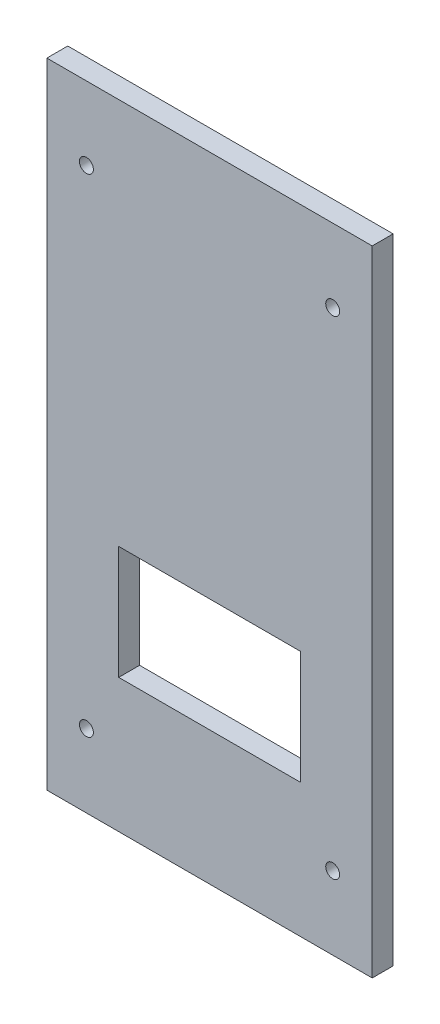
ISO-10303-21;
HEADER;
FILE_DESCRIPTION(('STEP AP214'),'2;1');
FILE_NAME('part.step','',(''),(''),'','','');
FILE_SCHEMA(('AUTOMOTIVE_DESIGN { 1 0 10303 214 1 1 1 1 }'));
ENDSEC;
DATA;
#1=APPLICATION_CONTEXT('core data for automotive mechanical design processes');
#2=APPLICATION_PROTOCOL_DEFINITION('international standard','automotive_design',2000,#1);
#3=PRODUCT_CONTEXT('',#1,'mechanical');
#4=PRODUCT('Part','Part','',(#3));
#5=PRODUCT_RELATED_PRODUCT_CATEGORY('part','',(#4));
#6=PRODUCT_DEFINITION_FORMATION('','',#4);
#7=PRODUCT_DEFINITION_CONTEXT('part definition',#1,'design');
#8=PRODUCT_DEFINITION('design','',#6,#7);
#9=PRODUCT_DEFINITION_SHAPE('','',#8);
#10=(LENGTH_UNIT() NAMED_UNIT(*) SI_UNIT(.MILLI.,.METRE.));
#11=(NAMED_UNIT(*) PLANE_ANGLE_UNIT() SI_UNIT($,.RADIAN.));
#12=(NAMED_UNIT(*) SI_UNIT($,.STERADIAN.) SOLID_ANGLE_UNIT());
#13=UNCERTAINTY_MEASURE_WITH_UNIT(LENGTH_MEASURE(1.E-05),#10,'distance_accuracy_value','');
#14=(GEOMETRIC_REPRESENTATION_CONTEXT(3) GLOBAL_UNCERTAINTY_ASSIGNED_CONTEXT((#13)) GLOBAL_UNIT_ASSIGNED_CONTEXT((#10,
#11,#12)) REPRESENTATION_CONTEXT('',''));
#15=CARTESIAN_POINT('',(0.,0.,0.));
#16=DIRECTION('',(0.,0.,1.));
#17=DIRECTION('',(1.,0.,0.));
#18=AXIS2_PLACEMENT_3D('',#15,#16,#17);
#19=CARTESIAN_POINT('',(0.,0.,3.));
#20=DIRECTION('',(0.,0.,1.));
#21=DIRECTION('',(1.,0.,0.));
#22=AXIS2_PLACEMENT_3D('',#19,#20,#21);
#23=PLANE('',#22);
#24=DIRECTION('',(-1.,0.,0.));
#25=VECTOR('',#24,1.);
#26=CARTESIAN_POINT('',(-13.0367519837217,-10.0460923834394,3.));
#27=LINE('',#26,#25);
#28=CARTESIAN_POINT('',(13.0367519837217,-10.0460923834394,3.));
#29=VERTEX_POINT('',#28);
#30=CARTESIAN_POINT('',(-13.0367519837217,-10.0460923834394,3.));
#31=VERTEX_POINT('',#30);
#32=EDGE_CURVE('E106',#29,#31,#27,.T.);
#33=ORIENTED_EDGE('',*,*,#32,.F.);
#34=DIRECTION('',(0.,1.,0.));
#35=VECTOR('',#34,1.);
#36=CARTESIAN_POINT('',(13.0367519837217,-10.0460923834394,3.));
#37=LINE('',#36,#35);
#38=CARTESIAN_POINT('',(13.0367519837217,-26.3240790269605,3.));
#39=VERTEX_POINT('',#38);
#40=EDGE_CURVE('E98',#39,#29,#37,.T.);
#41=ORIENTED_EDGE('',*,*,#40,.F.);
#42=DIRECTION('',(1.,0.,0.));
#43=VECTOR('',#42,1.);
#44=CARTESIAN_POINT('',(-13.0367519837217,-26.3240790269605,3.));
#45=LINE('',#44,#43);
#46=CARTESIAN_POINT('',(-13.0367519837217,-26.3240790269605,3.));
#47=VERTEX_POINT('',#46);
#48=EDGE_CURVE('E121',#47,#39,#45,.T.);
#49=ORIENTED_EDGE('',*,*,#48,.F.);
#50=DIRECTION('',(0.,-1.,0.));
#51=VECTOR('',#50,1.);
#52=CARTESIAN_POINT('',(-13.0367519837217,-10.0460923834394,3.));
#53=LINE('',#52,#51);
#54=EDGE_CURVE('E119',#31,#47,#53,.T.);
#55=ORIENTED_EDGE('',*,*,#54,.F.);
#56=EDGE_LOOP('',(#33,#41,#49,#55));
#57=FACE_BOUND('',#56,.T.);
#58=CARTESIAN_POINT('',(-17.675,35.,3.));
#59=DIRECTION('',(0.,0.,1.));
#60=DIRECTION('',(-1.,0.,0.));
#61=AXIS2_PLACEMENT_3D('',#58,#59,#60);
#62=CIRCLE('',#61,1.);
#63=CARTESIAN_POINT('',(-18.675,35.,3.));
#64=VERTEX_POINT('',#63);
#65=EDGE_CURVE('E137',#64,#64,#62,.T.);
#66=ORIENTED_EDGE('',*,*,#65,.F.);
#67=EDGE_LOOP('',(#66));
#68=FACE_BOUND('',#67,.T.);
#69=CARTESIAN_POINT('',(17.675,35.,3.));
#70=DIRECTION('',(0.,0.,1.));
#71=DIRECTION('',(1.,0.,0.));
#72=AXIS2_PLACEMENT_3D('',#69,#70,#71);
#73=CIRCLE('',#72,1.);
#74=CARTESIAN_POINT('',(18.675,35.,3.));
#75=VERTEX_POINT('',#74);
#76=EDGE_CURVE('E149',#75,#75,#73,.T.);
#77=ORIENTED_EDGE('',*,*,#76,.F.);
#78=EDGE_LOOP('',(#77));
#79=FACE_BOUND('',#78,.T.);
#80=DIRECTION('',(0.,1.,0.));
#81=VECTOR('',#80,1.);
#82=CARTESIAN_POINT('',(23.35,45.5,3.));
#83=LINE('',#82,#81);
#84=CARTESIAN_POINT('',(23.35,-45.5,3.));
#85=VERTEX_POINT('',#84);
#86=CARTESIAN_POINT('',(23.35,45.5,3.));
#87=VERTEX_POINT('',#86);
#88=EDGE_CURVE('E155',#85,#87,#83,.T.);
#89=ORIENTED_EDGE('',*,*,#88,.T.);
#90=DIRECTION('',(-1.,0.,0.));
#91=VECTOR('',#90,1.);
#92=CARTESIAN_POINT('',(-23.35,45.5,3.));
#93=LINE('',#92,#91);
#94=CARTESIAN_POINT('',(-23.35,45.5,3.));
#95=VERTEX_POINT('',#94);
#96=EDGE_CURVE('E158',#87,#95,#93,.T.);
#97=ORIENTED_EDGE('',*,*,#96,.T.);
#98=DIRECTION('',(0.,-1.,0.));
#99=VECTOR('',#98,1.);
#100=CARTESIAN_POINT('',(-23.35,45.5,3.));
#101=LINE('',#100,#99);
#102=CARTESIAN_POINT('',(-23.35,-45.5,3.));
#103=VERTEX_POINT('',#102);
#104=EDGE_CURVE('E161',#95,#103,#101,.T.);
#105=ORIENTED_EDGE('',*,*,#104,.T.);
#106=DIRECTION('',(1.,0.,0.));
#107=VECTOR('',#106,1.);
#108=CARTESIAN_POINT('',(-23.35,-45.5,3.));
#109=LINE('',#108,#107);
#110=EDGE_CURVE('E163',#103,#85,#109,.T.);
#111=ORIENTED_EDGE('',*,*,#110,.T.);
#112=EDGE_LOOP('',(#89,#97,#105,#111));
#113=FACE_BOUND('',#112,.T.);
#114=CARTESIAN_POINT('',(-17.675,-35.,3.));
#115=DIRECTION('',(0.,0.,1.));
#116=DIRECTION('',(1.,0.,0.));
#117=AXIS2_PLACEMENT_3D('',#114,#115,#116);
#118=CIRCLE('',#117,1.);
#119=CARTESIAN_POINT('',(-16.675,-35.,3.));
#120=VERTEX_POINT('',#119);
#121=EDGE_CURVE('E143',#120,#120,#118,.T.);
#122=ORIENTED_EDGE('',*,*,#121,.F.);
#123=EDGE_LOOP('',(#122));
#124=FACE_BOUND('',#123,.T.);
#125=CARTESIAN_POINT('',(17.675,-35.,3.));
#126=DIRECTION('',(0.,0.,1.));
#127=DIRECTION('',(-1.,0.,0.));
#128=AXIS2_PLACEMENT_3D('',#125,#126,#127);
#129=CIRCLE('',#128,1.);
#130=CARTESIAN_POINT('',(16.675,-35.,3.));
#131=VERTEX_POINT('',#130);
#132=EDGE_CURVE('E127',#131,#131,#129,.T.);
#133=ORIENTED_EDGE('',*,*,#132,.F.);
#134=EDGE_LOOP('',(#133));
#135=FACE_BOUND('',#134,.T.);
#136=ADVANCED_FACE('F33',(#57,#68,#79,#113,#124,#135),#23,.T.);
#137=CARTESIAN_POINT('',(0.,0.,0.));
#138=DIRECTION('',(0.,0.,1.));
#139=DIRECTION('',(1.,0.,0.));
#140=AXIS2_PLACEMENT_3D('',#137,#138,#139);
#141=PLANE('',#140);
#142=CARTESIAN_POINT('',(-17.675,35.,0.));
#143=DIRECTION('',(0.,0.,1.));
#144=DIRECTION('',(-1.,0.,0.));
#145=AXIS2_PLACEMENT_3D('',#142,#143,#144);
#146=CIRCLE('',#145,1.);
#147=CARTESIAN_POINT('',(-18.675,35.,0.));
#148=VERTEX_POINT('',#147);
#149=EDGE_CURVE('E114',#148,#148,#146,.T.);
#150=ORIENTED_EDGE('',*,*,#149,.T.);
#151=EDGE_LOOP('',(#150));
#152=FACE_BOUND('',#151,.T.);
#153=CARTESIAN_POINT('',(-17.675,-35.,0.));
#154=DIRECTION('',(0.,0.,1.));
#155=DIRECTION('',(1.,0.,0.));
#156=AXIS2_PLACEMENT_3D('',#153,#154,#155);
#157=CIRCLE('',#156,1.);
#158=CARTESIAN_POINT('',(-16.675,-35.,0.));
#159=VERTEX_POINT('',#158);
#160=EDGE_CURVE('E140',#159,#159,#157,.T.);
#161=ORIENTED_EDGE('',*,*,#160,.T.);
#162=EDGE_LOOP('',(#161));
#163=FACE_BOUND('',#162,.T.);
#164=CARTESIAN_POINT('',(17.675,35.,0.));
#165=DIRECTION('',(0.,0.,1.));
#166=DIRECTION('',(1.,0.,0.));
#167=AXIS2_PLACEMENT_3D('',#164,#165,#166);
#168=CIRCLE('',#167,1.);
#169=CARTESIAN_POINT('',(18.675,35.,0.));
#170=VERTEX_POINT('',#169);
#171=EDGE_CURVE('E146',#170,#170,#168,.T.);
#172=ORIENTED_EDGE('',*,*,#171,.T.);
#173=EDGE_LOOP('',(#172));
#174=FACE_BOUND('',#173,.T.);
#175=DIRECTION('',(0.,1.,0.));
#176=VECTOR('',#175,1.);
#177=CARTESIAN_POINT('',(23.35,45.5,0.));
#178=LINE('',#177,#176);
#179=CARTESIAN_POINT('',(23.35,-45.5,0.));
#180=VERTEX_POINT('',#179);
#181=CARTESIAN_POINT('',(23.35,45.5,0.));
#182=VERTEX_POINT('',#181);
#183=EDGE_CURVE('E152',#180,#182,#178,.T.);
#184=ORIENTED_EDGE('',*,*,#183,.F.);
#185=DIRECTION('',(1.,0.,0.));
#186=VECTOR('',#185,1.);
#187=CARTESIAN_POINT('',(-23.35,-45.5,0.));
#188=LINE('',#187,#186);
#189=CARTESIAN_POINT('',(-23.35,-45.5,0.));
#190=VERTEX_POINT('',#189);
#191=EDGE_CURVE('E159',#190,#180,#188,.T.);
#192=ORIENTED_EDGE('',*,*,#191,.F.);
#193=DIRECTION('',(0.,-1.,0.));
#194=VECTOR('',#193,1.);
#195=CARTESIAN_POINT('',(-23.35,45.5,0.));
#196=LINE('',#195,#194);
#197=CARTESIAN_POINT('',(-23.35,45.5,0.));
#198=VERTEX_POINT('',#197);
#199=EDGE_CURVE('E170',#198,#190,#196,.T.);
#200=ORIENTED_EDGE('',*,*,#199,.F.);
#201=DIRECTION('',(-1.,0.,0.));
#202=VECTOR('',#201,1.);
#203=CARTESIAN_POINT('',(-23.35,45.5,0.));
#204=LINE('',#203,#202);
#205=EDGE_CURVE('E168',#182,#198,#204,.T.);
#206=ORIENTED_EDGE('',*,*,#205,.F.);
#207=EDGE_LOOP('',(#184,#192,#200,#206));
#208=FACE_BOUND('',#207,.T.);
#209=DIRECTION('',(0.,1.,0.));
#210=VECTOR('',#209,1.);
#211=CARTESIAN_POINT('',(13.0367519837217,-10.0460923834394,0.));
#212=LINE('',#211,#210);
#213=CARTESIAN_POINT('',(13.0367519837217,-26.3240790269605,0.));
#214=VERTEX_POINT('',#213);
#215=CARTESIAN_POINT('',(13.0367519837217,-10.0460923834394,0.));
#216=VERTEX_POINT('',#215);
#217=EDGE_CURVE('E56',#214,#216,#212,.T.);
#218=ORIENTED_EDGE('',*,*,#217,.T.);
#219=DIRECTION('',(-1.,0.,0.));
#220=VECTOR('',#219,1.);
#221=CARTESIAN_POINT('',(-13.0367519837217,-10.0460923834394,0.));
#222=LINE('',#221,#220);
#223=CARTESIAN_POINT('',(-13.0367519837217,-10.0460923834394,0.));
#224=VERTEX_POINT('',#223);
#225=EDGE_CURVE('E113',#216,#224,#222,.T.);
#226=ORIENTED_EDGE('',*,*,#225,.T.);
#227=DIRECTION('',(0.,-1.,0.));
#228=VECTOR('',#227,1.);
#229=CARTESIAN_POINT('',(-13.0367519837217,-10.0460923834394,0.));
#230=LINE('',#229,#228);
#231=CARTESIAN_POINT('',(-13.0367519837217,-26.3240790269605,0.));
#232=VERTEX_POINT('',#231);
#233=EDGE_CURVE('E129',#224,#232,#230,.T.);
#234=ORIENTED_EDGE('',*,*,#233,.T.);
#235=DIRECTION('',(1.,0.,0.));
#236=VECTOR('',#235,1.);
#237=CARTESIAN_POINT('',(-13.0367519837217,-26.3240790269605,0.));
#238=LINE('',#237,#236);
#239=EDGE_CURVE('E107',#232,#214,#238,.T.);
#240=ORIENTED_EDGE('',*,*,#239,.T.);
#241=EDGE_LOOP('',(#218,#226,#234,#240));
#242=FACE_BOUND('',#241,.T.);
#243=CARTESIAN_POINT('',(17.675,-35.,0.));
#244=DIRECTION('',(0.,0.,1.));
#245=DIRECTION('',(-1.,0.,0.));
#246=AXIS2_PLACEMENT_3D('',#243,#244,#245);
#247=CIRCLE('',#246,1.);
#248=CARTESIAN_POINT('',(16.675,-35.,0.));
#249=VERTEX_POINT('',#248);
#250=EDGE_CURVE('E261',#249,#249,#247,.T.);
#251=ORIENTED_EDGE('',*,*,#250,.T.);
#252=EDGE_LOOP('',(#251));
#253=FACE_BOUND('',#252,.T.);
#254=ADVANCED_FACE('F188',(#152,#163,#174,#208,#242,#253),#141,.F.);
#255=CARTESIAN_POINT('',(23.35,45.5,3.));
#256=DIRECTION('',(-1.,0.,0.));
#257=DIRECTION('',(0.,0.,1.));
#258=AXIS2_PLACEMENT_3D('',#255,#256,#257);
#259=PLANE('',#258);
#260=ORIENTED_EDGE('',*,*,#183,.T.);
#261=DIRECTION('',(0.,0.,-1.));
#262=VECTOR('',#261,1.);
#263=CARTESIAN_POINT('',(23.35,45.5,3.));
#264=LINE('',#263,#262);
#265=EDGE_CURVE('E11',#87,#182,#264,.T.);
#266=ORIENTED_EDGE('',*,*,#265,.F.);
#267=ORIENTED_EDGE('',*,*,#88,.F.);
#268=DIRECTION('',(0.,0.,-1.));
#269=VECTOR('',#268,1.);
#270=CARTESIAN_POINT('',(23.35,-45.5,3.));
#271=LINE('',#270,#269);
#272=EDGE_CURVE('E165',#85,#180,#271,.T.);
#273=ORIENTED_EDGE('',*,*,#272,.T.);
#274=EDGE_LOOP('',(#260,#266,#267,#273));
#275=FACE_BOUND('',#274,.T.);
#276=ADVANCED_FACE('F35',(#275),#259,.F.);
#277=CARTESIAN_POINT('',(-23.35,45.5,3.));
#278=DIRECTION('',(0.,-1.,0.));
#279=DIRECTION('',(0.,0.,-1.));
#280=AXIS2_PLACEMENT_3D('',#277,#278,#279);
#281=PLANE('',#280);
#282=ORIENTED_EDGE('',*,*,#205,.T.);
#283=DIRECTION('',(0.,0.,-1.));
#284=VECTOR('',#283,1.);
#285=CARTESIAN_POINT('',(-23.35,45.5,3.));
#286=LINE('',#285,#284);
#287=EDGE_CURVE('E41',#95,#198,#286,.T.);
#288=ORIENTED_EDGE('',*,*,#287,.F.);
#289=ORIENTED_EDGE('',*,*,#96,.F.);
#290=ORIENTED_EDGE('',*,*,#265,.T.);
#291=EDGE_LOOP('',(#282,#288,#289,#290));
#292=FACE_BOUND('',#291,.T.);
#293=ADVANCED_FACE('F199',(#292),#281,.F.);
#294=CARTESIAN_POINT('',(-23.35,45.5,3.));
#295=DIRECTION('',(1.,0.,0.));
#296=DIRECTION('',(0.,0.,-1.));
#297=AXIS2_PLACEMENT_3D('',#294,#295,#296);
#298=PLANE('',#297);
#299=ORIENTED_EDGE('',*,*,#199,.T.);
#300=DIRECTION('',(0.,0.,-1.));
#301=VECTOR('',#300,1.);
#302=CARTESIAN_POINT('',(-23.35,-45.5,3.));
#303=LINE('',#302,#301);
#304=EDGE_CURVE('E175',#103,#190,#303,.T.);
#305=ORIENTED_EDGE('',*,*,#304,.F.);
#306=ORIENTED_EDGE('',*,*,#104,.F.);
#307=ORIENTED_EDGE('',*,*,#287,.T.);
#308=EDGE_LOOP('',(#299,#305,#306,#307));
#309=FACE_BOUND('',#308,.T.);
#310=ADVANCED_FACE('F182',(#309),#298,.F.);
#311=CARTESIAN_POINT('',(-23.35,-45.5,3.));
#312=DIRECTION('',(0.,1.,0.));
#313=DIRECTION('',(0.,0.,1.));
#314=AXIS2_PLACEMENT_3D('',#311,#312,#313);
#315=PLANE('',#314);
#316=ORIENTED_EDGE('',*,*,#191,.T.);
#317=ORIENTED_EDGE('',*,*,#272,.F.);
#318=ORIENTED_EDGE('',*,*,#110,.F.);
#319=ORIENTED_EDGE('',*,*,#304,.T.);
#320=EDGE_LOOP('',(#316,#317,#318,#319));
#321=FACE_BOUND('',#320,.T.);
#322=ADVANCED_FACE('F192',(#321),#315,.F.);
#323=CARTESIAN_POINT('',(17.675,35.,3.));
#324=DIRECTION('',(0.,0.,-1.));
#325=DIRECTION('',(-1.,0.,0.));
#326=AXIS2_PLACEMENT_3D('',#323,#324,#325);
#327=CYLINDRICAL_SURFACE('',#326,1.);
#328=ORIENTED_EDGE('',*,*,#76,.T.);
#329=EDGE_LOOP('',(#328));
#330=FACE_BOUND('',#329,.T.);
#331=ORIENTED_EDGE('',*,*,#171,.F.);
#332=EDGE_LOOP('',(#331));
#333=FACE_BOUND('',#332,.T.);
#334=ADVANCED_FACE('F214',(#330,#333),#327,.F.);
#335=CARTESIAN_POINT('',(-17.675,-35.,3.));
#336=DIRECTION('',(0.,0.,-1.));
#337=DIRECTION('',(-1.,0.,0.));
#338=AXIS2_PLACEMENT_3D('',#335,#336,#337);
#339=CYLINDRICAL_SURFACE('',#338,1.);
#340=ORIENTED_EDGE('',*,*,#121,.T.);
#341=EDGE_LOOP('',(#340));
#342=FACE_BOUND('',#341,.T.);
#343=ORIENTED_EDGE('',*,*,#160,.F.);
#344=EDGE_LOOP('',(#343));
#345=FACE_BOUND('',#344,.T.);
#346=ADVANCED_FACE('F221',(#342,#345),#339,.F.);
#347=CARTESIAN_POINT('',(-17.675,35.,3.));
#348=DIRECTION('',(0.,0.,-1.));
#349=DIRECTION('',(-1.,0.,0.));
#350=AXIS2_PLACEMENT_3D('',#347,#348,#349);
#351=CYLINDRICAL_SURFACE('',#350,1.);
#352=ORIENTED_EDGE('',*,*,#65,.T.);
#353=EDGE_LOOP('',(#352));
#354=FACE_BOUND('',#353,.T.);
#355=ORIENTED_EDGE('',*,*,#149,.F.);
#356=EDGE_LOOP('',(#355));
#357=FACE_BOUND('',#356,.T.);
#358=ADVANCED_FACE('F226',(#354,#357),#351,.F.);
#359=CARTESIAN_POINT('',(13.0367519837217,-10.0460923834394,3.));
#360=DIRECTION('',(-1.,0.,0.));
#361=DIRECTION('',(0.,0.,1.));
#362=AXIS2_PLACEMENT_3D('',#359,#360,#361);
#363=PLANE('',#362);
#364=ORIENTED_EDGE('',*,*,#217,.F.);
#365=DIRECTION('',(0.,0.,-1.));
#366=VECTOR('',#365,1.);
#367=CARTESIAN_POINT('',(13.0367519837217,-26.3240790269605,3.));
#368=LINE('',#367,#366);
#369=EDGE_CURVE('E102',#39,#214,#368,.T.);
#370=ORIENTED_EDGE('',*,*,#369,.F.);
#371=ORIENTED_EDGE('',*,*,#40,.T.);
#372=DIRECTION('',(0.,0.,-1.));
#373=VECTOR('',#372,1.);
#374=CARTESIAN_POINT('',(13.0367519837217,-10.0460923834394,3.));
#375=LINE('',#374,#373);
#376=EDGE_CURVE('E101',#29,#216,#375,.T.);
#377=ORIENTED_EDGE('',*,*,#376,.T.);
#378=EDGE_LOOP('',(#364,#370,#371,#377));
#379=FACE_BOUND('',#378,.T.);
#380=ADVANCED_FACE('F100',(#379),#363,.T.);
#381=CARTESIAN_POINT('',(-13.0367519837217,-10.0460923834394,3.));
#382=DIRECTION('',(0.,-1.,0.));
#383=DIRECTION('',(0.,0.,-1.));
#384=AXIS2_PLACEMENT_3D('',#381,#382,#383);
#385=PLANE('',#384);
#386=ORIENTED_EDGE('',*,*,#225,.F.);
#387=ORIENTED_EDGE('',*,*,#376,.F.);
#388=ORIENTED_EDGE('',*,*,#32,.T.);
#389=DIRECTION('',(0.,0.,-1.));
#390=VECTOR('',#389,1.);
#391=CARTESIAN_POINT('',(-13.0367519837217,-10.0460923834394,3.));
#392=LINE('',#391,#390);
#393=EDGE_CURVE('E115',#31,#224,#392,.T.);
#394=ORIENTED_EDGE('',*,*,#393,.T.);
#395=EDGE_LOOP('',(#386,#387,#388,#394));
#396=FACE_BOUND('',#395,.T.);
#397=ADVANCED_FACE('F110',(#396),#385,.T.);
#398=CARTESIAN_POINT('',(-13.0367519837217,-10.0460923834394,3.));
#399=DIRECTION('',(1.,0.,0.));
#400=DIRECTION('',(0.,0.,-1.));
#401=AXIS2_PLACEMENT_3D('',#398,#399,#400);
#402=PLANE('',#401);
#403=ORIENTED_EDGE('',*,*,#233,.F.);
#404=ORIENTED_EDGE('',*,*,#393,.F.);
#405=ORIENTED_EDGE('',*,*,#54,.T.);
#406=DIRECTION('',(0.,0.,-1.));
#407=VECTOR('',#406,1.);
#408=CARTESIAN_POINT('',(-13.0367519837217,-26.3240790269605,3.));
#409=LINE('',#408,#407);
#410=EDGE_CURVE('E48',#47,#232,#409,.T.);
#411=ORIENTED_EDGE('',*,*,#410,.T.);
#412=EDGE_LOOP('',(#403,#404,#405,#411));
#413=FACE_BOUND('',#412,.T.);
#414=ADVANCED_FACE('F244',(#413),#402,.T.);
#415=CARTESIAN_POINT('',(-13.0367519837217,-26.3240790269605,3.));
#416=DIRECTION('',(0.,1.,0.));
#417=DIRECTION('',(0.,0.,1.));
#418=AXIS2_PLACEMENT_3D('',#415,#416,#417);
#419=PLANE('',#418);
#420=ORIENTED_EDGE('',*,*,#239,.F.);
#421=ORIENTED_EDGE('',*,*,#410,.F.);
#422=ORIENTED_EDGE('',*,*,#48,.T.);
#423=ORIENTED_EDGE('',*,*,#369,.T.);
#424=EDGE_LOOP('',(#420,#421,#422,#423));
#425=FACE_BOUND('',#424,.T.);
#426=ADVANCED_FACE('F247',(#425),#419,.T.);
#427=CARTESIAN_POINT('',(17.675,-35.,3.));
#428=DIRECTION('',(0.,0.,-1.));
#429=DIRECTION('',(-1.,0.,0.));
#430=AXIS2_PLACEMENT_3D('',#427,#428,#429);
#431=CYLINDRICAL_SURFACE('',#430,1.);
#432=ORIENTED_EDGE('',*,*,#132,.T.);
#433=EDGE_LOOP('',(#432));
#434=FACE_BOUND('',#433,.T.);
#435=ORIENTED_EDGE('',*,*,#250,.F.);
#436=EDGE_LOOP('',(#435));
#437=FACE_BOUND('',#436,.T.);
#438=ADVANCED_FACE('F251',(#434,#437),#431,.F.);
#439=CLOSED_SHELL('',(#136,#254,#276,#293,#310,#322,#334,#346,#358,#380,#397,#414,#426,#438));
#440=MANIFOLD_SOLID_BREP('B2',#439);
#441=ADVANCED_BREP_SHAPE_REPRESENTATION('',(#18,#440),#14);
#442=SHAPE_DEFINITION_REPRESENTATION(#9,#441);
ENDSEC;
END-ISO-10303-21;
